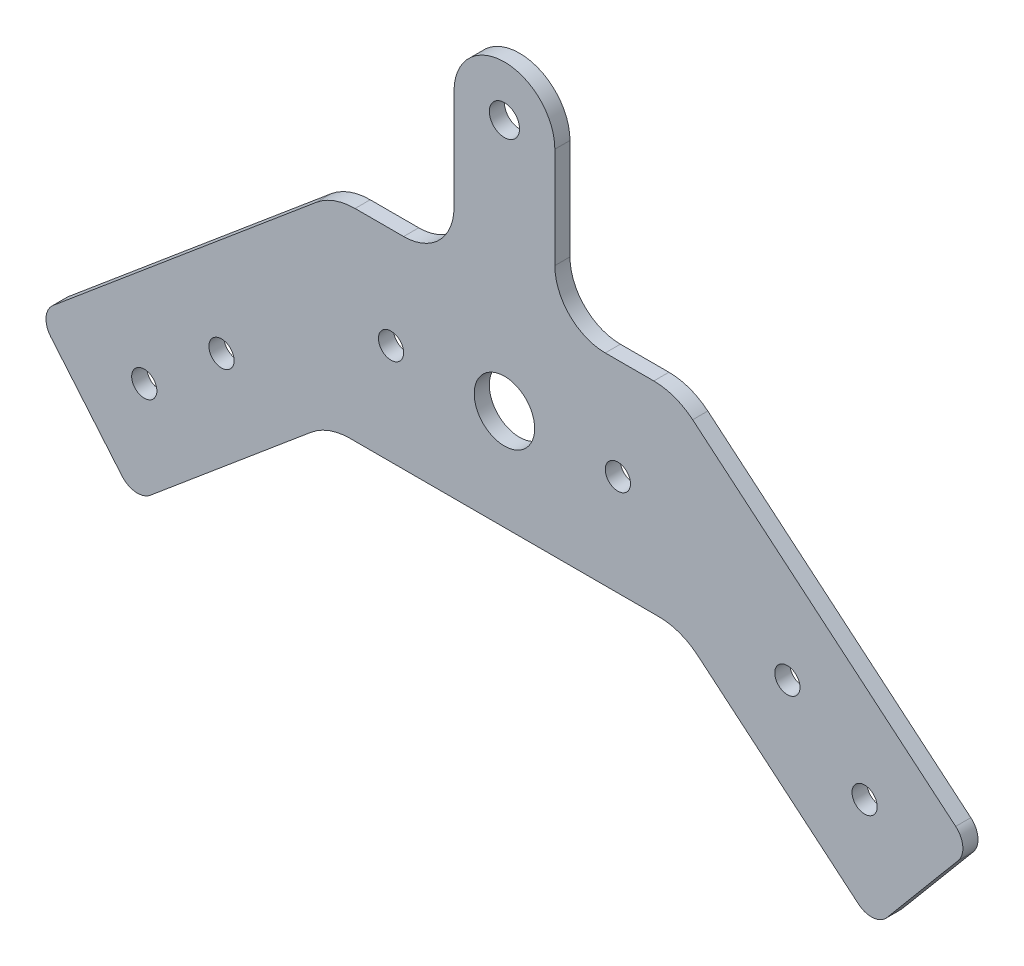
ISO-10303-21;
HEADER;
FILE_DESCRIPTION(('STEP AP214'),'2;1');
FILE_NAME('part.step','',(''),(''),'','','');
FILE_SCHEMA(('AUTOMOTIVE_DESIGN { 1 0 10303 214 1 1 1 1 }'));
ENDSEC;
DATA;
#1=APPLICATION_CONTEXT('core data for automotive mechanical design processes');
#2=APPLICATION_PROTOCOL_DEFINITION('international standard','automotive_design',2000,#1);
#3=PRODUCT_CONTEXT('',#1,'mechanical');
#4=PRODUCT('Part','Part','',(#3));
#5=PRODUCT_RELATED_PRODUCT_CATEGORY('part','',(#4));
#6=PRODUCT_DEFINITION_FORMATION('','',#4);
#7=PRODUCT_DEFINITION_CONTEXT('part definition',#1,'design');
#8=PRODUCT_DEFINITION('design','',#6,#7);
#9=PRODUCT_DEFINITION_SHAPE('','',#8);
#10=(LENGTH_UNIT() NAMED_UNIT(*) SI_UNIT(.MILLI.,.METRE.));
#11=(NAMED_UNIT(*) PLANE_ANGLE_UNIT() SI_UNIT($,.RADIAN.));
#12=(NAMED_UNIT(*) SI_UNIT($,.STERADIAN.) SOLID_ANGLE_UNIT());
#13=UNCERTAINTY_MEASURE_WITH_UNIT(LENGTH_MEASURE(1.E-05),#10,'distance_accuracy_value','');
#14=(GEOMETRIC_REPRESENTATION_CONTEXT(3) GLOBAL_UNCERTAINTY_ASSIGNED_CONTEXT((#13)) GLOBAL_UNIT_ASSIGNED_CONTEXT((#10,
#11,#12)) REPRESENTATION_CONTEXT('',''));
#15=CARTESIAN_POINT('',(0.,0.,0.));
#16=DIRECTION('',(0.,0.,1.));
#17=DIRECTION('',(1.,0.,0.));
#18=AXIS2_PLACEMENT_3D('',#15,#16,#17);
#19=CARTESIAN_POINT('',(-18.4144001216186,0.,-3.));
#20=DIRECTION('',(0.,-1.,0.));
#21=DIRECTION('',(1.,0.,0.));
#22=AXIS2_PLACEMENT_3D('',#19,#20,#21);
#23=PLANE('',#22);
#24=DIRECTION('',(1.,0.,0.));
#25=VECTOR('',#24,1.);
#26=CARTESIAN_POINT('',(-18.4144001216186,0.,0.));
#27=LINE('',#26,#25);
#28=CARTESIAN_POINT('',(-30.6323571888055,0.,0.));
#29=VERTEX_POINT('',#28);
#30=CARTESIAN_POINT('',(30.6323571888057,0.,0.));
#31=VERTEX_POINT('',#30);
#32=EDGE_CURVE('E278',#29,#31,#27,.T.);
#33=ORIENTED_EDGE('',*,*,#32,.F.);
#34=DIRECTION('',(0.,0.,1.));
#35=VECTOR('',#34,1.);
#36=CARTESIAN_POINT('',(-30.6323571888055,0.,-3.));
#37=LINE('',#36,#35);
#38=CARTESIAN_POINT('',(-30.6323571888055,0.,-3.));
#39=VERTEX_POINT('',#38);
#40=EDGE_CURVE('E11',#39,#29,#37,.T.);
#41=ORIENTED_EDGE('',*,*,#40,.F.);
#42=DIRECTION('',(1.,0.,0.));
#43=VECTOR('',#42,1.);
#44=CARTESIAN_POINT('',(-18.4144001216186,0.,-3.));
#45=LINE('',#44,#43);
#46=CARTESIAN_POINT('',(30.6323571888057,0.,-3.));
#47=VERTEX_POINT('',#46);
#48=EDGE_CURVE('E56',#39,#47,#45,.T.);
#49=ORIENTED_EDGE('',*,*,#48,.T.);
#50=DIRECTION('',(0.,0.,1.));
#51=VECTOR('',#50,1.);
#52=CARTESIAN_POINT('',(30.6323571888057,0.,-3.));
#53=LINE('',#52,#51);
#54=EDGE_CURVE('E41',#47,#31,#53,.T.);
#55=ORIENTED_EDGE('',*,*,#54,.T.);
#56=EDGE_LOOP('',(#33,#41,#49,#55));
#57=FACE_BOUND('',#56,.T.);
#58=ADVANCED_FACE('F37',(#57),#23,.T.);
#59=CARTESIAN_POINT('',(-30.6323571888055,-12.,-3.));
#60=DIRECTION('',(0.,0.,1.));
#61=DIRECTION('',(1.,0.,0.));
#62=AXIS2_PLACEMENT_3D('',#59,#60,#61);
#63=CYLINDRICAL_SURFACE('',#62,12.);
#64=CARTESIAN_POINT('',(-30.6323571888055,-12.,0.));
#65=DIRECTION('',(0.,0.,-1.));
#66=DIRECTION('',(1.,0.,0.));
#67=AXIS2_PLACEMENT_3D('',#64,#65,#66);
#68=CIRCLE('',#67,12.);
#69=CARTESIAN_POINT('',(-38.345808505044,-2.80746668257224,0.));
#70=VERTEX_POINT('',#69);
#71=EDGE_CURVE('E276',#70,#29,#68,.T.);
#72=ORIENTED_EDGE('',*,*,#71,.F.);
#73=DIRECTION('',(0.,0.,1.));
#74=VECTOR('',#73,1.);
#75=CARTESIAN_POINT('',(-38.345808505044,-2.80746668257224,-3.));
#76=LINE('',#75,#74);
#77=CARTESIAN_POINT('',(-38.345808505044,-2.80746668257224,-3.));
#78=VERTEX_POINT('',#77);
#79=EDGE_CURVE('E47',#78,#70,#76,.T.);
#80=ORIENTED_EDGE('',*,*,#79,.F.);
#81=CARTESIAN_POINT('',(-30.6323571888055,-12.,-3.));
#82=DIRECTION('',(0.,0.,-1.));
#83=DIRECTION('',(1.,0.,0.));
#84=AXIS2_PLACEMENT_3D('',#81,#82,#83);
#85=CIRCLE('',#84,12.);
#86=EDGE_CURVE('E208',#78,#39,#85,.T.);
#87=ORIENTED_EDGE('',*,*,#86,.T.);
#88=ORIENTED_EDGE('',*,*,#40,.T.);
#89=EDGE_LOOP('',(#72,#80,#87,#88));
#90=FACE_BOUND('',#89,.T.);
#91=ADVANCED_FACE('F321',(#90),#63,.F.);
#92=CARTESIAN_POINT('',(-38.345808505044,-2.80746668257224,-3.));
#93=DIRECTION('',(0.642787609686538,-0.766044443118979,0.));
#94=DIRECTION('',(0.766044443118979,0.642787609686538,0.));
#95=AXIS2_PLACEMENT_3D('',#92,#93,#94);
#96=PLANE('',#95);
#97=DIRECTION('',(0.766044443118979,0.642787609686538,0.));
#98=VECTOR('',#97,1.);
#99=CARTESIAN_POINT('',(-38.345808505044,-2.80746668257224,0.));
#100=LINE('',#99,#98);
#101=CARTESIAN_POINT('',(-70.238044383473,-29.5682300455807,0.));
#102=VERTEX_POINT('',#101);
#103=EDGE_CURVE('E196',#102,#70,#100,.T.);
#104=ORIENTED_EDGE('',*,*,#103,.F.);
#105=DIRECTION('',(0.,0.,1.));
#106=VECTOR('',#105,1.);
#107=CARTESIAN_POINT('',(-70.238044383473,-29.5682300455807,-3.));
#108=LINE('',#107,#106);
#109=CARTESIAN_POINT('',(-70.238044383473,-29.5682300455807,-3.));
#110=VERTEX_POINT('',#109);
#111=EDGE_CURVE('E191',#110,#102,#108,.T.);
#112=ORIENTED_EDGE('',*,*,#111,.F.);
#113=DIRECTION('',(0.766044443118979,0.642787609686538,0.));
#114=VECTOR('',#113,1.);
#115=CARTESIAN_POINT('',(-38.345808505044,-2.80746668257224,-3.));
#116=LINE('',#115,#114);
#117=EDGE_CURVE('E194',#110,#78,#116,.T.);
#118=ORIENTED_EDGE('',*,*,#117,.T.);
#119=ORIENTED_EDGE('',*,*,#79,.T.);
#120=EDGE_LOOP('',(#104,#112,#118,#119));
#121=FACE_BOUND('',#120,.T.);
#122=ADVANCED_FACE('F193',(#121),#96,.T.);
#123=CARTESIAN_POINT('',(-72.8091948222192,-26.5040522731048,-3.));
#124=DIRECTION('',(0.,0.,1.));
#125=DIRECTION('',(1.,0.,0.));
#126=AXIS2_PLACEMENT_3D('',#123,#124,#125);
#127=CYLINDRICAL_SURFACE('',#126,4.);
#128=CARTESIAN_POINT('',(-72.8091948222192,-26.5040522731048,0.));
#129=DIRECTION('',(0.,0.,1.));
#130=DIRECTION('',(-1.,0.,0.));
#131=AXIS2_PLACEMENT_3D('',#128,#129,#130);
#132=CIRCLE('',#131,4.);
#133=CARTESIAN_POINT('',(-75.8733725946951,-29.075202711851,0.));
#134=VERTEX_POINT('',#133);
#135=EDGE_CURVE('E273',#134,#102,#132,.T.);
#136=ORIENTED_EDGE('',*,*,#135,.F.);
#137=DIRECTION('',(0.,0.,1.));
#138=VECTOR('',#137,1.);
#139=CARTESIAN_POINT('',(-75.8733725946951,-29.075202711851,-3.));
#140=LINE('',#139,#138);
#141=CARTESIAN_POINT('',(-75.8733725946951,-29.075202711851,-3.));
#142=VERTEX_POINT('',#141);
#143=EDGE_CURVE('E201',#142,#134,#140,.T.);
#144=ORIENTED_EDGE('',*,*,#143,.F.);
#145=CARTESIAN_POINT('',(-72.8091948222192,-26.5040522731048,-3.));
#146=DIRECTION('',(0.,0.,1.));
#147=DIRECTION('',(-1.,0.,0.));
#148=AXIS2_PLACEMENT_3D('',#145,#146,#147);
#149=CIRCLE('',#148,4.);
#150=EDGE_CURVE('E206',#142,#110,#149,.T.);
#151=ORIENTED_EDGE('',*,*,#150,.T.);
#152=ORIENTED_EDGE('',*,*,#111,.T.);
#153=EDGE_LOOP('',(#136,#144,#151,#152));
#154=FACE_BOUND('',#153,.T.);
#155=ADVANCED_FACE('F210',(#154),#127,.T.);
#156=CARTESIAN_POINT('',(-75.8733725946951,-29.075202711851,-3.));
#157=DIRECTION('',(-0.766044443118979,-0.642787609686538,0.));
#158=DIRECTION('',(0.642787609686538,-0.766044443118979,0.));
#159=AXIS2_PLACEMENT_3D('',#156,#157,#158);
#160=PLANE('',#159);
#161=DIRECTION('',(0.642787609686538,-0.766044443118979,0.));
#162=VECTOR('',#161,1.);
#163=CARTESIAN_POINT('',(-75.8733725946951,-29.075202711851,0.));
#164=LINE('',#163,#162);
#165=CARTESIAN_POINT('',(-90.0147000077989,-12.2222249632334,0.));
#166=VERTEX_POINT('',#165);
#167=EDGE_CURVE('E270',#166,#134,#164,.T.);
#168=ORIENTED_EDGE('',*,*,#167,.F.);
#169=DIRECTION('',(0.,0.,1.));
#170=VECTOR('',#169,1.);
#171=CARTESIAN_POINT('',(-90.0147000077989,-12.2222249632334,-3.));
#172=LINE('',#171,#170);
#173=CARTESIAN_POINT('',(-90.0147000077989,-12.2222249632334,-3.));
#174=VERTEX_POINT('',#173);
#175=EDGE_CURVE('E282',#174,#166,#172,.T.);
#176=ORIENTED_EDGE('',*,*,#175,.F.);
#177=DIRECTION('',(0.642787609686538,-0.766044443118979,0.));
#178=VECTOR('',#177,1.);
#179=CARTESIAN_POINT('',(-75.8733725946951,-29.075202711851,-3.));
#180=LINE('',#179,#178);
#181=EDGE_CURVE('E211',#174,#142,#180,.T.);
#182=ORIENTED_EDGE('',*,*,#181,.T.);
#183=ORIENTED_EDGE('',*,*,#143,.T.);
#184=EDGE_LOOP('',(#168,#176,#182,#183));
#185=FACE_BOUND('',#184,.T.);
#186=ADVANCED_FACE('F334',(#185),#160,.T.);
#187=CARTESIAN_POINT('',(-86.950522235323,-9.65107452448727,-3.));
#188=DIRECTION('',(0.,0.,1.));
#189=DIRECTION('',(1.,0.,0.));
#190=AXIS2_PLACEMENT_3D('',#187,#188,#189);
#191=CYLINDRICAL_SURFACE('',#190,3.99999999999999);
#192=CARTESIAN_POINT('',(-86.950522235323,-9.65107452448727,0.));
#193=DIRECTION('',(0.,0.,1.));
#194=DIRECTION('',(1.,0.,0.));
#195=AXIS2_PLACEMENT_3D('',#192,#193,#194);
#196=CIRCLE('',#195,3.99999999999999);
#197=CARTESIAN_POINT('',(-89.5216726740692,-6.58689675201136,0.));
#198=VERTEX_POINT('',#197);
#199=EDGE_CURVE('E267',#198,#166,#196,.T.);
#200=ORIENTED_EDGE('',*,*,#199,.F.);
#201=DIRECTION('',(0.,0.,1.));
#202=VECTOR('',#201,1.);
#203=CARTESIAN_POINT('',(-89.5216726740692,-6.58689675201136,-3.));
#204=LINE('',#203,#202);
#205=CARTESIAN_POINT('',(-89.5216726740692,-6.58689675201136,-3.));
#206=VERTEX_POINT('',#205);
#207=EDGE_CURVE('E284',#206,#198,#204,.T.);
#208=ORIENTED_EDGE('',*,*,#207,.F.);
#209=CARTESIAN_POINT('',(-86.950522235323,-9.65107452448727,-3.));
#210=DIRECTION('',(0.,0.,1.));
#211=DIRECTION('',(1.,0.,0.));
#212=AXIS2_PLACEMENT_3D('',#209,#210,#211);
#213=CIRCLE('',#212,3.99999999999999);
#214=EDGE_CURVE('E213',#206,#174,#213,.T.);
#215=ORIENTED_EDGE('',*,*,#214,.T.);
#216=ORIENTED_EDGE('',*,*,#175,.T.);
#217=EDGE_LOOP('',(#200,#208,#215,#216));
#218=FACE_BOUND('',#217,.T.);
#219=ADVANCED_FACE('F337',(#218),#191,.T.);
#220=CARTESIAN_POINT('',(-89.5216726740692,-6.58689675201136,-3.));
#221=DIRECTION('',(-0.642787609686538,0.766044443118979,0.));
#222=DIRECTION('',(-0.766044443118979,-0.642787609686538,0.));
#223=AXIS2_PLACEMENT_3D('',#220,#221,#222);
#224=PLANE('',#223);
#225=DIRECTION('',(-0.766044443118979,-0.642787609686538,0.));
#226=VECTOR('',#225,1.);
#227=CARTESIAN_POINT('',(-89.5216726740692,-6.58689675201136,0.));
#228=LINE('',#227,#226);
#229=CARTESIAN_POINT('',(-37.3473796070879,37.1925333174278,0.));
#230=VERTEX_POINT('',#229);
#231=EDGE_CURVE('E264',#230,#198,#228,.T.);
#232=ORIENTED_EDGE('',*,*,#231,.F.);
#233=DIRECTION('',(0.,0.,1.));
#234=VECTOR('',#233,1.);
#235=CARTESIAN_POINT('',(-37.3473796070879,37.1925333174278,-3.));
#236=LINE('',#235,#234);
#237=CARTESIAN_POINT('',(-37.3473796070879,37.1925333174278,-3.));
#238=VERTEX_POINT('',#237);
#239=EDGE_CURVE('E286',#238,#230,#236,.T.);
#240=ORIENTED_EDGE('',*,*,#239,.F.);
#241=DIRECTION('',(-0.766044443118979,-0.642787609686538,0.));
#242=VECTOR('',#241,1.);
#243=CARTESIAN_POINT('',(-89.5216726740692,-6.58689675201136,-3.));
#244=LINE('',#243,#242);
#245=EDGE_CURVE('E457',#238,#206,#244,.T.);
#246=ORIENTED_EDGE('',*,*,#245,.T.);
#247=ORIENTED_EDGE('',*,*,#207,.T.);
#248=EDGE_LOOP('',(#232,#240,#246,#247));
#249=FACE_BOUND('',#248,.T.);
#250=ADVANCED_FACE('F341',(#249),#224,.T.);
#251=CARTESIAN_POINT('',(-29.6339282908495,28.,-3.));
#252=DIRECTION('',(0.,0.,1.));
#253=DIRECTION('',(1.,0.,0.));
#254=AXIS2_PLACEMENT_3D('',#251,#252,#253);
#255=CYLINDRICAL_SURFACE('',#254,12.);
#256=CARTESIAN_POINT('',(-29.6339282908495,28.,0.));
#257=DIRECTION('',(0.,0.,1.));
#258=DIRECTION('',(-1.,0.,0.));
#259=AXIS2_PLACEMENT_3D('',#256,#257,#258);
#260=CIRCLE('',#259,12.);
#261=CARTESIAN_POINT('',(-29.6339282908495,40.,0.));
#262=VERTEX_POINT('',#261);
#263=EDGE_CURVE('E261',#262,#230,#260,.T.);
#264=ORIENTED_EDGE('',*,*,#263,.F.);
#265=DIRECTION('',(0.,0.,1.));
#266=VECTOR('',#265,1.);
#267=CARTESIAN_POINT('',(-29.6339282908495,40.,-3.));
#268=LINE('',#267,#266);
#269=CARTESIAN_POINT('',(-29.6339282908495,40.,-3.));
#270=VERTEX_POINT('',#269);
#271=EDGE_CURVE('E288',#270,#262,#268,.T.);
#272=ORIENTED_EDGE('',*,*,#271,.F.);
#273=CARTESIAN_POINT('',(-29.6339282908495,28.,-3.));
#274=DIRECTION('',(0.,0.,1.));
#275=DIRECTION('',(-1.,0.,0.));
#276=AXIS2_PLACEMENT_3D('',#273,#274,#275);
#277=CIRCLE('',#276,12.);
#278=EDGE_CURVE('E461',#270,#238,#277,.T.);
#279=ORIENTED_EDGE('',*,*,#278,.T.);
#280=ORIENTED_EDGE('',*,*,#239,.T.);
#281=EDGE_LOOP('',(#264,#272,#279,#280));
#282=FACE_BOUND('',#281,.T.);
#283=ADVANCED_FACE('F345',(#282),#255,.T.);
#284=CARTESIAN_POINT('',(-29.6339282908495,40.,-3.));
#285=DIRECTION('',(0.,1.,0.));
#286=DIRECTION('',(-1.,0.,0.));
#287=AXIS2_PLACEMENT_3D('',#284,#285,#286);
#288=PLANE('',#287);
#289=DIRECTION('',(-1.,0.,0.));
#290=VECTOR('',#289,1.);
#291=CARTESIAN_POINT('',(-29.6339282908495,40.,0.));
#292=LINE('',#291,#290);
#293=CARTESIAN_POINT('',(-20.0000000000001,40.,0.));
#294=VERTEX_POINT('',#293);
#295=EDGE_CURVE('E258',#294,#262,#292,.T.);
#296=ORIENTED_EDGE('',*,*,#295,.F.);
#297=DIRECTION('',(0.,0.,1.));
#298=VECTOR('',#297,1.);
#299=CARTESIAN_POINT('',(-20.0000000000001,40.,-3.));
#300=LINE('',#299,#298);
#301=CARTESIAN_POINT('',(-20.0000000000001,40.,-3.));
#302=VERTEX_POINT('',#301);
#303=EDGE_CURVE('E290',#302,#294,#300,.T.);
#304=ORIENTED_EDGE('',*,*,#303,.F.);
#305=DIRECTION('',(-1.,0.,0.));
#306=VECTOR('',#305,1.);
#307=CARTESIAN_POINT('',(-29.6339282908495,40.,-3.));
#308=LINE('',#307,#306);
#309=EDGE_CURVE('E450',#302,#270,#308,.T.);
#310=ORIENTED_EDGE('',*,*,#309,.T.);
#311=ORIENTED_EDGE('',*,*,#271,.T.);
#312=EDGE_LOOP('',(#296,#304,#310,#311));
#313=FACE_BOUND('',#312,.T.);
#314=ADVANCED_FACE('F349',(#313),#288,.T.);
#315=CARTESIAN_POINT('',(-20.,50.,-3.));
#316=DIRECTION('',(0.,0.,1.));
#317=DIRECTION('',(1.,0.,0.));
#318=AXIS2_PLACEMENT_3D('',#315,#316,#317);
#319=CYLINDRICAL_SURFACE('',#318,10.);
#320=CARTESIAN_POINT('',(-20.,50.,0.));
#321=DIRECTION('',(0.,0.,-1.));
#322=DIRECTION('',(-1.,0.,0.));
#323=AXIS2_PLACEMENT_3D('',#320,#321,#322);
#324=CIRCLE('',#323,10.);
#325=CARTESIAN_POINT('',(-9.99999999999999,50.0000000000001,0.));
#326=VERTEX_POINT('',#325);
#327=EDGE_CURVE('E255',#326,#294,#324,.T.);
#328=ORIENTED_EDGE('',*,*,#327,.F.);
#329=DIRECTION('',(0.,0.,1.));
#330=VECTOR('',#329,1.);
#331=CARTESIAN_POINT('',(-9.99999999999999,50.0000000000001,-3.));
#332=LINE('',#331,#330);
#333=CARTESIAN_POINT('',(-9.99999999999999,50.0000000000001,-3.));
#334=VERTEX_POINT('',#333);
#335=EDGE_CURVE('E292',#334,#326,#332,.T.);
#336=ORIENTED_EDGE('',*,*,#335,.F.);
#337=CARTESIAN_POINT('',(-20.,50.,-3.));
#338=DIRECTION('',(0.,0.,-1.));
#339=DIRECTION('',(-1.,0.,0.));
#340=AXIS2_PLACEMENT_3D('',#337,#338,#339);
#341=CIRCLE('',#340,10.);
#342=EDGE_CURVE('E446',#334,#302,#341,.T.);
#343=ORIENTED_EDGE('',*,*,#342,.T.);
#344=ORIENTED_EDGE('',*,*,#303,.T.);
#345=EDGE_LOOP('',(#328,#336,#343,#344));
#346=FACE_BOUND('',#345,.T.);
#347=ADVANCED_FACE('F353',(#346),#319,.F.);
#348=CARTESIAN_POINT('',(-10.,70.,-3.));
#349=DIRECTION('',(-1.,0.,0.));
#350=DIRECTION('',(0.,-1.,0.));
#351=AXIS2_PLACEMENT_3D('',#348,#349,#350);
#352=PLANE('',#351);
#353=DIRECTION('',(0.,-1.,0.));
#354=VECTOR('',#353,1.);
#355=CARTESIAN_POINT('',(-10.,70.,0.));
#356=LINE('',#355,#354);
#357=CARTESIAN_POINT('',(-10.,70.,0.));
#358=VERTEX_POINT('',#357);
#359=EDGE_CURVE('E252',#358,#326,#356,.T.);
#360=ORIENTED_EDGE('',*,*,#359,.F.);
#361=DIRECTION('',(0.,0.,1.));
#362=VECTOR('',#361,1.);
#363=CARTESIAN_POINT('',(-10.,70.,-3.));
#364=LINE('',#363,#362);
#365=CARTESIAN_POINT('',(-10.,70.,-3.));
#366=VERTEX_POINT('',#365);
#367=EDGE_CURVE('E294',#366,#358,#364,.T.);
#368=ORIENTED_EDGE('',*,*,#367,.F.);
#369=DIRECTION('',(0.,-1.,0.));
#370=VECTOR('',#369,1.);
#371=CARTESIAN_POINT('',(-10.,70.,-3.));
#372=LINE('',#371,#370);
#373=EDGE_CURVE('E467',#366,#334,#372,.T.);
#374=ORIENTED_EDGE('',*,*,#373,.T.);
#375=ORIENTED_EDGE('',*,*,#335,.T.);
#376=EDGE_LOOP('',(#360,#368,#374,#375));
#377=FACE_BOUND('',#376,.T.);
#378=ADVANCED_FACE('F357',(#377),#352,.T.);
#379=CARTESIAN_POINT('',(0.,70.,-3.));
#380=DIRECTION('',(0.,0.,1.));
#381=DIRECTION('',(1.,0.,0.));
#382=AXIS2_PLACEMENT_3D('',#379,#380,#381);
#383=CYLINDRICAL_SURFACE('',#382,10.);
#384=CARTESIAN_POINT('',(0.,70.,0.));
#385=DIRECTION('',(0.,0.,1.));
#386=DIRECTION('',(1.,0.,0.));
#387=AXIS2_PLACEMENT_3D('',#384,#385,#386);
#388=CIRCLE('',#387,10.);
#389=CARTESIAN_POINT('',(10.,70.,0.));
#390=VERTEX_POINT('',#389);
#391=EDGE_CURVE('E249',#390,#358,#388,.T.);
#392=ORIENTED_EDGE('',*,*,#391,.F.);
#393=DIRECTION('',(0.,0.,1.));
#394=VECTOR('',#393,1.);
#395=CARTESIAN_POINT('',(10.,70.,-3.));
#396=LINE('',#395,#394);
#397=CARTESIAN_POINT('',(10.,70.,-3.));
#398=VERTEX_POINT('',#397);
#399=EDGE_CURVE('E296',#398,#390,#396,.T.);
#400=ORIENTED_EDGE('',*,*,#399,.F.);
#401=CARTESIAN_POINT('',(0.,70.,-3.));
#402=DIRECTION('',(0.,0.,1.));
#403=DIRECTION('',(1.,0.,0.));
#404=AXIS2_PLACEMENT_3D('',#401,#402,#403);
#405=CIRCLE('',#404,10.);
#406=EDGE_CURVE('E439',#398,#366,#405,.T.);
#407=ORIENTED_EDGE('',*,*,#406,.T.);
#408=ORIENTED_EDGE('',*,*,#367,.T.);
#409=EDGE_LOOP('',(#392,#400,#407,#408));
#410=FACE_BOUND('',#409,.T.);
#411=ADVANCED_FACE('F361',(#410),#383,.T.);
#412=CARTESIAN_POINT('',(10.,70.,-3.));
#413=DIRECTION('',(1.,0.,0.));
#414=DIRECTION('',(0.,0.,-1.));
#415=AXIS2_PLACEMENT_3D('',#412,#413,#414);
#416=PLANE('',#415);
#417=DIRECTION('',(0.,1.,0.));
#418=VECTOR('',#417,1.);
#419=CARTESIAN_POINT('',(10.,70.,0.));
#420=LINE('',#419,#418);
#421=CARTESIAN_POINT('',(10.,50.0000000000001,0.));
#422=VERTEX_POINT('',#421);
#423=EDGE_CURVE('E246',#422,#390,#420,.T.);
#424=ORIENTED_EDGE('',*,*,#423,.F.);
#425=DIRECTION('',(0.,0.,1.));
#426=VECTOR('',#425,1.);
#427=CARTESIAN_POINT('',(10.,50.0000000000001,-3.));
#428=LINE('',#427,#426);
#429=CARTESIAN_POINT('',(10.,50.0000000000001,-3.));
#430=VERTEX_POINT('',#429);
#431=EDGE_CURVE('E298',#430,#422,#428,.T.);
#432=ORIENTED_EDGE('',*,*,#431,.F.);
#433=DIRECTION('',(0.,1.,0.));
#434=VECTOR('',#433,1.);
#435=CARTESIAN_POINT('',(10.,70.,-3.));
#436=LINE('',#435,#434);
#437=EDGE_CURVE('E435',#430,#398,#436,.T.);
#438=ORIENTED_EDGE('',*,*,#437,.T.);
#439=ORIENTED_EDGE('',*,*,#399,.T.);
#440=EDGE_LOOP('',(#424,#432,#438,#439));
#441=FACE_BOUND('',#440,.T.);
#442=ADVANCED_FACE('F365',(#441),#416,.T.);
#443=CARTESIAN_POINT('',(20.,50.,-3.));
#444=DIRECTION('',(0.,0.,1.));
#445=DIRECTION('',(1.,0.,0.));
#446=AXIS2_PLACEMENT_3D('',#443,#444,#445);
#447=CYLINDRICAL_SURFACE('',#446,10.);
#448=CARTESIAN_POINT('',(20.,50.,0.));
#449=DIRECTION('',(0.,0.,-1.));
#450=DIRECTION('',(1.,0.,0.));
#451=AXIS2_PLACEMENT_3D('',#448,#449,#450);
#452=CIRCLE('',#451,10.);
#453=CARTESIAN_POINT('',(20.0000000000001,40.,0.));
#454=VERTEX_POINT('',#453);
#455=EDGE_CURVE('E243',#454,#422,#452,.T.);
#456=ORIENTED_EDGE('',*,*,#455,.F.);
#457=DIRECTION('',(0.,0.,1.));
#458=VECTOR('',#457,1.);
#459=CARTESIAN_POINT('',(20.0000000000001,40.,-3.));
#460=LINE('',#459,#458);
#461=CARTESIAN_POINT('',(20.0000000000001,40.,-3.));
#462=VERTEX_POINT('',#461);
#463=EDGE_CURVE('E300',#462,#454,#460,.T.);
#464=ORIENTED_EDGE('',*,*,#463,.F.);
#465=CARTESIAN_POINT('',(20.,50.,-3.));
#466=DIRECTION('',(0.,0.,-1.));
#467=DIRECTION('',(1.,0.,0.));
#468=AXIS2_PLACEMENT_3D('',#465,#466,#467);
#469=CIRCLE('',#468,10.);
#470=EDGE_CURVE('E471',#462,#430,#469,.T.);
#471=ORIENTED_EDGE('',*,*,#470,.T.);
#472=ORIENTED_EDGE('',*,*,#431,.T.);
#473=EDGE_LOOP('',(#456,#464,#471,#472));
#474=FACE_BOUND('',#473,.T.);
#475=ADVANCED_FACE('F369',(#474),#447,.F.);
#476=CARTESIAN_POINT('',(29.6339282908495,40.,-3.));
#477=DIRECTION('',(0.,1.,0.));
#478=DIRECTION('',(-1.,0.,0.));
#479=AXIS2_PLACEMENT_3D('',#476,#477,#478);
#480=PLANE('',#479);
#481=DIRECTION('',(-1.,0.,0.));
#482=VECTOR('',#481,1.);
#483=CARTESIAN_POINT('',(29.6339282908495,40.,0.));
#484=LINE('',#483,#482);
#485=CARTESIAN_POINT('',(29.6339282908495,40.,0.));
#486=VERTEX_POINT('',#485);
#487=EDGE_CURVE('E240',#486,#454,#484,.T.);
#488=ORIENTED_EDGE('',*,*,#487,.F.);
#489=DIRECTION('',(0.,0.,1.));
#490=VECTOR('',#489,1.);
#491=CARTESIAN_POINT('',(29.6339282908495,40.,-3.));
#492=LINE('',#491,#490);
#493=CARTESIAN_POINT('',(29.6339282908495,40.,-3.));
#494=VERTEX_POINT('',#493);
#495=EDGE_CURVE('E302',#494,#486,#492,.T.);
#496=ORIENTED_EDGE('',*,*,#495,.F.);
#497=DIRECTION('',(-1.,0.,0.));
#498=VECTOR('',#497,1.);
#499=CARTESIAN_POINT('',(29.6339282908495,40.,-3.));
#500=LINE('',#499,#498);
#501=EDGE_CURVE('E428',#494,#462,#500,.T.);
#502=ORIENTED_EDGE('',*,*,#501,.T.);
#503=ORIENTED_EDGE('',*,*,#463,.T.);
#504=EDGE_LOOP('',(#488,#496,#502,#503));
#505=FACE_BOUND('',#504,.T.);
#506=ADVANCED_FACE('F373',(#505),#480,.T.);
#507=CARTESIAN_POINT('',(29.6339282908495,28.,-3.));
#508=DIRECTION('',(0.,0.,1.));
#509=DIRECTION('',(1.,0.,0.));
#510=AXIS2_PLACEMENT_3D('',#507,#508,#509);
#511=CYLINDRICAL_SURFACE('',#510,12.);
#512=CARTESIAN_POINT('',(29.6339282908495,28.,0.));
#513=DIRECTION('',(0.,0.,1.));
#514=DIRECTION('',(1.,0.,0.));
#515=AXIS2_PLACEMENT_3D('',#512,#513,#514);
#516=CIRCLE('',#515,12.);
#517=CARTESIAN_POINT('',(37.3473796070879,37.1925333174278,0.));
#518=VERTEX_POINT('',#517);
#519=EDGE_CURVE('E237',#518,#486,#516,.T.);
#520=ORIENTED_EDGE('',*,*,#519,.F.);
#521=DIRECTION('',(0.,0.,1.));
#522=VECTOR('',#521,1.);
#523=CARTESIAN_POINT('',(37.3473796070879,37.1925333174278,-3.));
#524=LINE('',#523,#522);
#525=CARTESIAN_POINT('',(37.3473796070879,37.1925333174278,-3.));
#526=VERTEX_POINT('',#525);
#527=EDGE_CURVE('E304',#526,#518,#524,.T.);
#528=ORIENTED_EDGE('',*,*,#527,.F.);
#529=CARTESIAN_POINT('',(29.6339282908495,28.,-3.));
#530=DIRECTION('',(0.,0.,1.));
#531=DIRECTION('',(1.,0.,0.));
#532=AXIS2_PLACEMENT_3D('',#529,#530,#531);
#533=CIRCLE('',#532,12.);
#534=EDGE_CURVE('E424',#526,#494,#533,.T.);
#535=ORIENTED_EDGE('',*,*,#534,.T.);
#536=ORIENTED_EDGE('',*,*,#495,.T.);
#537=EDGE_LOOP('',(#520,#528,#535,#536));
#538=FACE_BOUND('',#537,.T.);
#539=ADVANCED_FACE('F377',(#538),#511,.T.);
#540=CARTESIAN_POINT('',(89.5216726740692,-6.58689675201139,-3.));
#541=DIRECTION('',(0.642787609686538,0.766044443118979,0.));
#542=DIRECTION('',(-0.766044443118979,0.642787609686538,0.));
#543=AXIS2_PLACEMENT_3D('',#540,#541,#542);
#544=PLANE('',#543);
#545=DIRECTION('',(-0.766044443118979,0.642787609686538,0.));
#546=VECTOR('',#545,1.);
#547=CARTESIAN_POINT('',(89.5216726740692,-6.58689675201139,0.));
#548=LINE('',#547,#546);
#549=CARTESIAN_POINT('',(89.5216726740692,-6.58689675201138,0.));
#550=VERTEX_POINT('',#549);
#551=EDGE_CURVE('E234',#550,#518,#548,.T.);
#552=ORIENTED_EDGE('',*,*,#551,.F.);
#553=DIRECTION('',(0.,0.,1.));
#554=VECTOR('',#553,1.);
#555=CARTESIAN_POINT('',(89.5216726740692,-6.58689675201138,-3.));
#556=LINE('',#555,#554);
#557=CARTESIAN_POINT('',(89.5216726740692,-6.58689675201138,-3.));
#558=VERTEX_POINT('',#557);
#559=EDGE_CURVE('E306',#558,#550,#556,.T.);
#560=ORIENTED_EDGE('',*,*,#559,.F.);
#561=DIRECTION('',(-0.766044443118979,0.642787609686538,0.));
#562=VECTOR('',#561,1.);
#563=CARTESIAN_POINT('',(89.5216726740692,-6.58689675201139,-3.));
#564=LINE('',#563,#562);
#565=EDGE_CURVE('E475',#558,#526,#564,.T.);
#566=ORIENTED_EDGE('',*,*,#565,.T.);
#567=ORIENTED_EDGE('',*,*,#527,.T.);
#568=EDGE_LOOP('',(#552,#560,#566,#567));
#569=FACE_BOUND('',#568,.T.);
#570=ADVANCED_FACE('F381',(#569),#544,.T.);
#571=CARTESIAN_POINT('',(86.950522235323,-9.65107452448731,-3.));
#572=DIRECTION('',(0.,0.,1.));
#573=DIRECTION('',(1.,0.,0.));
#574=AXIS2_PLACEMENT_3D('',#571,#572,#573);
#575=CYLINDRICAL_SURFACE('',#574,4.00000000000001);
#576=CARTESIAN_POINT('',(86.950522235323,-9.65107452448731,0.));
#577=DIRECTION('',(0.,0.,1.));
#578=DIRECTION('',(-1.,0.,0.));
#579=AXIS2_PLACEMENT_3D('',#576,#577,#578);
#580=CIRCLE('',#579,4.00000000000001);
#581=CARTESIAN_POINT('',(90.014700007799,-12.2222249632335,0.));
#582=VERTEX_POINT('',#581);
#583=EDGE_CURVE('E231',#582,#550,#580,.T.);
#584=ORIENTED_EDGE('',*,*,#583,.F.);
#585=DIRECTION('',(0.,0.,1.));
#586=VECTOR('',#585,1.);
#587=CARTESIAN_POINT('',(90.014700007799,-12.2222249632335,-3.));
#588=LINE('',#587,#586);
#589=CARTESIAN_POINT('',(90.014700007799,-12.2222249632335,-3.));
#590=VERTEX_POINT('',#589);
#591=EDGE_CURVE('E308',#590,#582,#588,.T.);
#592=ORIENTED_EDGE('',*,*,#591,.F.);
#593=CARTESIAN_POINT('',(86.950522235323,-9.65107452448731,-3.));
#594=DIRECTION('',(0.,0.,1.));
#595=DIRECTION('',(-1.,0.,0.));
#596=AXIS2_PLACEMENT_3D('',#593,#594,#595);
#597=CIRCLE('',#596,4.00000000000001);
#598=EDGE_CURVE('E417',#590,#558,#597,.T.);
#599=ORIENTED_EDGE('',*,*,#598,.T.);
#600=ORIENTED_EDGE('',*,*,#559,.T.);
#601=EDGE_LOOP('',(#584,#592,#599,#600));
#602=FACE_BOUND('',#601,.T.);
#603=ADVANCED_FACE('F385',(#602),#575,.T.);
#604=CARTESIAN_POINT('',(90.014700007799,-12.2222249632335,-3.));
#605=DIRECTION('',(0.766044443118979,-0.642787609686538,0.));
#606=DIRECTION('',(0.642787609686538,0.766044443118979,0.));
#607=AXIS2_PLACEMENT_3D('',#604,#605,#606);
#608=PLANE('',#607);
#609=DIRECTION('',(0.642787609686538,0.766044443118979,0.));
#610=VECTOR('',#609,1.);
#611=CARTESIAN_POINT('',(90.014700007799,-12.2222249632335,0.));
#612=LINE('',#611,#610);
#613=CARTESIAN_POINT('',(75.8733725946952,-29.0752027118509,0.));
#614=VERTEX_POINT('',#613);
#615=EDGE_CURVE('E228',#614,#582,#612,.T.);
#616=ORIENTED_EDGE('',*,*,#615,.F.);
#617=DIRECTION('',(0.,0.,1.));
#618=VECTOR('',#617,1.);
#619=CARTESIAN_POINT('',(75.8733725946952,-29.0752027118509,-3.));
#620=LINE('',#619,#618);
#621=CARTESIAN_POINT('',(75.8733725946952,-29.0752027118509,-3.));
#622=VERTEX_POINT('',#621);
#623=EDGE_CURVE('E310',#622,#614,#620,.T.);
#624=ORIENTED_EDGE('',*,*,#623,.F.);
#625=DIRECTION('',(0.642787609686538,0.766044443118979,0.));
#626=VECTOR('',#625,1.);
#627=CARTESIAN_POINT('',(90.014700007799,-12.2222249632335,-3.));
#628=LINE('',#627,#626);
#629=EDGE_CURVE('E413',#622,#590,#628,.T.);
#630=ORIENTED_EDGE('',*,*,#629,.T.);
#631=ORIENTED_EDGE('',*,*,#591,.T.);
#632=EDGE_LOOP('',(#616,#624,#630,#631));
#633=FACE_BOUND('',#632,.T.);
#634=ADVANCED_FACE('F389',(#633),#608,.T.);
#635=CARTESIAN_POINT('',(72.8091948222193,-26.5040522731048,-3.));
#636=DIRECTION('',(0.,0.,1.));
#637=DIRECTION('',(1.,0.,0.));
#638=AXIS2_PLACEMENT_3D('',#635,#636,#637);
#639=CYLINDRICAL_SURFACE('',#638,4.);
#640=CARTESIAN_POINT('',(72.8091948222193,-26.5040522731048,0.));
#641=DIRECTION('',(0.,0.,1.));
#642=DIRECTION('',(-1.,0.,0.));
#643=AXIS2_PLACEMENT_3D('',#640,#641,#642);
#644=CIRCLE('',#643,4.);
#645=CARTESIAN_POINT('',(70.2380443834731,-29.5682300455807,0.));
#646=VERTEX_POINT('',#645);
#647=EDGE_CURVE('E225',#646,#614,#644,.T.);
#648=ORIENTED_EDGE('',*,*,#647,.F.);
#649=DIRECTION('',(0.,0.,1.));
#650=VECTOR('',#649,1.);
#651=CARTESIAN_POINT('',(70.2380443834731,-29.5682300455807,-3.));
#652=LINE('',#651,#650);
#653=CARTESIAN_POINT('',(70.2380443834731,-29.5682300455807,-3.));
#654=VERTEX_POINT('',#653);
#655=EDGE_CURVE('E312',#654,#646,#652,.T.);
#656=ORIENTED_EDGE('',*,*,#655,.F.);
#657=CARTESIAN_POINT('',(72.8091948222193,-26.5040522731048,-3.));
#658=DIRECTION('',(0.,0.,1.));
#659=DIRECTION('',(-1.,0.,0.));
#660=AXIS2_PLACEMENT_3D('',#657,#658,#659);
#661=CIRCLE('',#660,4.);
#662=EDGE_CURVE('E479',#654,#622,#661,.T.);
#663=ORIENTED_EDGE('',*,*,#662,.T.);
#664=ORIENTED_EDGE('',*,*,#623,.T.);
#665=EDGE_LOOP('',(#648,#656,#663,#664));
#666=FACE_BOUND('',#665,.T.);
#667=ADVANCED_FACE('F393',(#666),#639,.T.);
#668=CARTESIAN_POINT('',(70.2380443834731,-29.5682300455807,-3.));
#669=DIRECTION('',(-0.642787609686537,-0.76604444311898,0.));
#670=DIRECTION('',(0.76604444311898,-0.642787609686537,0.));
#671=AXIS2_PLACEMENT_3D('',#668,#669,#670);
#672=PLANE('',#671);
#673=DIRECTION('',(0.76604444311898,-0.642787609686537,0.));
#674=VECTOR('',#673,1.);
#675=CARTESIAN_POINT('',(70.2380443834731,-29.5682300455807,0.));
#676=LINE('',#675,#674);
#677=CARTESIAN_POINT('',(38.3458085050441,-2.80746668257222,0.));
#678=VERTEX_POINT('',#677);
#679=EDGE_CURVE('E221',#678,#646,#676,.T.);
#680=ORIENTED_EDGE('',*,*,#679,.F.);
#681=DIRECTION('',(0.,0.,1.));
#682=VECTOR('',#681,1.);
#683=CARTESIAN_POINT('',(38.3458085050441,-2.80746668257222,-3.));
#684=LINE('',#683,#682);
#685=CARTESIAN_POINT('',(38.3458085050441,-2.80746668257222,-3.));
#686=VERTEX_POINT('',#685);
#687=EDGE_CURVE('E313',#686,#678,#684,.T.);
#688=ORIENTED_EDGE('',*,*,#687,.F.);
#689=DIRECTION('',(0.76604444311898,-0.642787609686537,0.));
#690=VECTOR('',#689,1.);
#691=CARTESIAN_POINT('',(70.2380443834731,-29.5682300455807,-3.));
#692=LINE('',#691,#690);
#693=EDGE_CURVE('E406',#686,#654,#692,.T.);
#694=ORIENTED_EDGE('',*,*,#693,.T.);
#695=ORIENTED_EDGE('',*,*,#655,.T.);
#696=EDGE_LOOP('',(#680,#688,#694,#695));
#697=FACE_BOUND('',#696,.T.);
#698=ADVANCED_FACE('F396',(#697),#672,.T.);
#699=CARTESIAN_POINT('',(30.6323571888057,-12.,-3.));
#700=DIRECTION('',(0.,0.,1.));
#701=DIRECTION('',(1.,0.,0.));
#702=AXIS2_PLACEMENT_3D('',#699,#700,#701);
#703=CYLINDRICAL_SURFACE('',#702,12.);
#704=CARTESIAN_POINT('',(30.6323571888057,-12.,0.));
#705=DIRECTION('',(0.,0.,-1.));
#706=DIRECTION('',(1.,0.,0.));
#707=AXIS2_PLACEMENT_3D('',#704,#705,#706);
#708=CIRCLE('',#707,12.);
#709=EDGE_CURVE('E218',#31,#678,#708,.T.);
#710=ORIENTED_EDGE('',*,*,#709,.F.);
#711=ORIENTED_EDGE('',*,*,#54,.F.);
#712=CARTESIAN_POINT('',(30.6323571888057,-12.,-3.));
#713=DIRECTION('',(0.,0.,-1.));
#714=DIRECTION('',(1.,0.,0.));
#715=AXIS2_PLACEMENT_3D('',#712,#713,#714);
#716=CIRCLE('',#715,12.);
#717=EDGE_CURVE('E482',#47,#686,#716,.T.);
#718=ORIENTED_EDGE('',*,*,#717,.T.);
#719=ORIENTED_EDGE('',*,*,#687,.T.);
#720=EDGE_LOOP('',(#710,#711,#718,#719));
#721=FACE_BOUND('',#720,.T.);
#722=ADVANCED_FACE('F39',(#721),#703,.F.);
#723=CARTESIAN_POINT('',(30.6323571888057,-12.,-3.));
#724=DIRECTION('',(0.,0.,1.));
#725=DIRECTION('',(1.,0.,0.));
#726=AXIS2_PLACEMENT_3D('',#723,#724,#725);
#727=PLANE('',#726);
#728=CARTESIAN_POINT('',(22.5,20.,-3.));
#729=DIRECTION('',(0.,0.,1.));
#730=DIRECTION('',(-1.,0.,0.));
#731=AXIS2_PLACEMENT_3D('',#728,#729,#730);
#732=CIRCLE('',#731,2.5);
#733=CARTESIAN_POINT('',(20.,20.,-3.));
#734=VERTEX_POINT('',#733);
#735=EDGE_CURVE('E524',#734,#734,#732,.T.);
#736=ORIENTED_EDGE('',*,*,#735,.T.);
#737=EDGE_LOOP('',(#736));
#738=FACE_BOUND('',#737,.T.);
#739=CARTESIAN_POINT('',(-22.5,20.,-3.));
#740=DIRECTION('',(0.,0.,1.));
#741=DIRECTION('',(1.,0.,0.));
#742=AXIS2_PLACEMENT_3D('',#739,#740,#741);
#743=CIRCLE('',#742,2.5);
#744=CARTESIAN_POINT('',(-20.,20.,-3.));
#745=VERTEX_POINT('',#744);
#746=EDGE_CURVE('E518',#745,#745,#743,.T.);
#747=ORIENTED_EDGE('',*,*,#746,.T.);
#748=EDGE_LOOP('',(#747));
#749=FACE_BOUND('',#748,.T.);
#750=CARTESIAN_POINT('',(0.,20.,-3.));
#751=DIRECTION('',(0.,0.,1.));
#752=DIRECTION('',(1.,0.,0.));
#753=AXIS2_PLACEMENT_3D('',#750,#751,#752);
#754=CIRCLE('',#753,6.);
#755=CARTESIAN_POINT('',(6.,20.,-3.));
#756=VERTEX_POINT('',#755);
#757=EDGE_CURVE('E512',#756,#756,#754,.T.);
#758=ORIENTED_EDGE('',*,*,#757,.T.);
#759=EDGE_LOOP('',(#758));
#760=FACE_BOUND('',#759,.T.);
#761=CARTESIAN_POINT('',(71.4533696544623,-11.0068996922441,-3.));
#762=DIRECTION('',(0.,0.,1.));
#763=DIRECTION('',(-1.,0.,0.));
#764=AXIS2_PLACEMENT_3D('',#761,#762,#763);
#765=CIRCLE('',#764,2.49999999999999);
#766=CARTESIAN_POINT('',(68.9533696544623,-11.0068996922441,-3.));
#767=VERTEX_POINT('',#766);
#768=EDGE_CURVE('E506',#767,#767,#765,.T.);
#769=ORIENTED_EDGE('',*,*,#768,.T.);
#770=EDGE_LOOP('',(#769));
#771=FACE_BOUND('',#770,.T.);
#772=CARTESIAN_POINT('',(56.1324807920827,1.84885250148663,-3.));
#773=DIRECTION('',(0.,0.,1.));
#774=DIRECTION('',(-1.,0.,0.));
#775=AXIS2_PLACEMENT_3D('',#772,#773,#774);
#776=CIRCLE('',#775,2.49999999999999);
#777=CARTESIAN_POINT('',(53.6324807920828,1.84885250148663,-3.));
#778=VERTEX_POINT('',#777);
#779=EDGE_CURVE('E500',#778,#778,#776,.T.);
#780=ORIENTED_EDGE('',*,*,#779,.T.);
#781=EDGE_LOOP('',(#780));
#782=FACE_BOUND('',#781,.T.);
#783=CARTESIAN_POINT('',(-56.1324807920827,1.84885250148663,-3.));
#784=DIRECTION('',(0.,0.,1.));
#785=DIRECTION('',(1.,0.,0.));
#786=AXIS2_PLACEMENT_3D('',#783,#784,#785);
#787=CIRCLE('',#786,2.49999999999999);
#788=CARTESIAN_POINT('',(-53.6324807920828,1.84885250148663,-3.));
#789=VERTEX_POINT('',#788);
#790=EDGE_CURVE('E494',#789,#789,#787,.T.);
#791=ORIENTED_EDGE('',*,*,#790,.T.);
#792=EDGE_LOOP('',(#791));
#793=FACE_BOUND('',#792,.T.);
#794=CARTESIAN_POINT('',(-71.4533696544623,-11.0068996922441,-3.));
#795=DIRECTION('',(0.,0.,1.));
#796=DIRECTION('',(1.,0.,0.));
#797=AXIS2_PLACEMENT_3D('',#794,#795,#796);
#798=CIRCLE('',#797,2.49999999999999);
#799=CARTESIAN_POINT('',(-68.9533696544623,-11.0068996922441,-3.));
#800=VERTEX_POINT('',#799);
#801=EDGE_CURVE('E488',#800,#800,#798,.T.);
#802=ORIENTED_EDGE('',*,*,#801,.T.);
#803=EDGE_LOOP('',(#802));
#804=FACE_BOUND('',#803,.T.);
#805=CARTESIAN_POINT('',(0.,70.,-3.));
#806=DIRECTION('',(0.,0.,1.));
#807=DIRECTION('',(1.,0.,0.));
#808=AXIS2_PLACEMENT_3D('',#805,#806,#807);
#809=CIRCLE('',#808,3.);
#810=CARTESIAN_POINT('',(3.,70.,-3.));
#811=VERTEX_POINT('',#810);
#812=EDGE_CURVE('E222',#811,#811,#809,.T.);
#813=ORIENTED_EDGE('',*,*,#812,.T.);
#814=EDGE_LOOP('',(#813));
#815=FACE_BOUND('',#814,.T.);
#816=ORIENTED_EDGE('',*,*,#48,.F.);
#817=ORIENTED_EDGE('',*,*,#86,.F.);
#818=ORIENTED_EDGE('',*,*,#117,.F.);
#819=ORIENTED_EDGE('',*,*,#150,.F.);
#820=ORIENTED_EDGE('',*,*,#181,.F.);
#821=ORIENTED_EDGE('',*,*,#214,.F.);
#822=ORIENTED_EDGE('',*,*,#245,.F.);
#823=ORIENTED_EDGE('',*,*,#278,.F.);
#824=ORIENTED_EDGE('',*,*,#309,.F.);
#825=ORIENTED_EDGE('',*,*,#342,.F.);
#826=ORIENTED_EDGE('',*,*,#373,.F.);
#827=ORIENTED_EDGE('',*,*,#406,.F.);
#828=ORIENTED_EDGE('',*,*,#437,.F.);
#829=ORIENTED_EDGE('',*,*,#470,.F.);
#830=ORIENTED_EDGE('',*,*,#501,.F.);
#831=ORIENTED_EDGE('',*,*,#534,.F.);
#832=ORIENTED_EDGE('',*,*,#565,.F.);
#833=ORIENTED_EDGE('',*,*,#598,.F.);
#834=ORIENTED_EDGE('',*,*,#629,.F.);
#835=ORIENTED_EDGE('',*,*,#662,.F.);
#836=ORIENTED_EDGE('',*,*,#693,.F.);
#837=ORIENTED_EDGE('',*,*,#717,.F.);
#838=EDGE_LOOP('',(#816,#817,#818,#819,#820,#821,#822,#823,#824,#825,#826,#827,#828,#829,#830,
#831,#832,#833,#834,#835,#836,#837));
#839=FACE_BOUND('',#838,.T.);
#840=ADVANCED_FACE('F204',(#738,#749,#760,#771,#782,#793,#804,#815,#839),#727,.F.);
#841=CARTESIAN_POINT('',(30.6323571888057,-12.,0.));
#842=DIRECTION('',(0.,0.,1.));
#843=DIRECTION('',(1.,0.,0.));
#844=AXIS2_PLACEMENT_3D('',#841,#842,#843);
#845=PLANE('',#844);
#846=CARTESIAN_POINT('',(22.5,20.,0.));
#847=DIRECTION('',(0.,0.,1.));
#848=DIRECTION('',(-1.,0.,0.));
#849=AXIS2_PLACEMENT_3D('',#846,#847,#848);
#850=CIRCLE('',#849,2.5);
#851=CARTESIAN_POINT('',(20.,20.,0.));
#852=VERTEX_POINT('',#851);
#853=EDGE_CURVE('E527',#852,#852,#850,.T.);
#854=ORIENTED_EDGE('',*,*,#853,.F.);
#855=EDGE_LOOP('',(#854));
#856=FACE_BOUND('',#855,.T.);
#857=CARTESIAN_POINT('',(-22.5,20.,0.));
#858=DIRECTION('',(0.,0.,1.));
#859=DIRECTION('',(1.,0.,0.));
#860=AXIS2_PLACEMENT_3D('',#857,#858,#859);
#861=CIRCLE('',#860,2.5);
#862=CARTESIAN_POINT('',(-20.,20.,0.));
#863=VERTEX_POINT('',#862);
#864=EDGE_CURVE('E521',#863,#863,#861,.T.);
#865=ORIENTED_EDGE('',*,*,#864,.F.);
#866=EDGE_LOOP('',(#865));
#867=FACE_BOUND('',#866,.T.);
#868=CARTESIAN_POINT('',(0.,20.,0.));
#869=DIRECTION('',(0.,0.,1.));
#870=DIRECTION('',(1.,0.,0.));
#871=AXIS2_PLACEMENT_3D('',#868,#869,#870);
#872=CIRCLE('',#871,6.);
#873=CARTESIAN_POINT('',(6.,20.,0.));
#874=VERTEX_POINT('',#873);
#875=EDGE_CURVE('E515',#874,#874,#872,.T.);
#876=ORIENTED_EDGE('',*,*,#875,.F.);
#877=EDGE_LOOP('',(#876));
#878=FACE_BOUND('',#877,.T.);
#879=CARTESIAN_POINT('',(71.4533696544623,-11.0068996922441,0.));
#880=DIRECTION('',(0.,0.,1.));
#881=DIRECTION('',(-1.,0.,0.));
#882=AXIS2_PLACEMENT_3D('',#879,#880,#881);
#883=CIRCLE('',#882,2.49999999999999);
#884=CARTESIAN_POINT('',(68.9533696544623,-11.0068996922441,0.));
#885=VERTEX_POINT('',#884);
#886=EDGE_CURVE('E509',#885,#885,#883,.T.);
#887=ORIENTED_EDGE('',*,*,#886,.F.);
#888=EDGE_LOOP('',(#887));
#889=FACE_BOUND('',#888,.T.);
#890=CARTESIAN_POINT('',(56.1324807920827,1.84885250148663,0.));
#891=DIRECTION('',(0.,0.,1.));
#892=DIRECTION('',(-1.,0.,0.));
#893=AXIS2_PLACEMENT_3D('',#890,#891,#892);
#894=CIRCLE('',#893,2.49999999999999);
#895=CARTESIAN_POINT('',(53.6324807920828,1.84885250148663,0.));
#896=VERTEX_POINT('',#895);
#897=EDGE_CURVE('E503',#896,#896,#894,.T.);
#898=ORIENTED_EDGE('',*,*,#897,.F.);
#899=EDGE_LOOP('',(#898));
#900=FACE_BOUND('',#899,.T.);
#901=CARTESIAN_POINT('',(-56.1324807920827,1.84885250148663,0.));
#902=DIRECTION('',(0.,0.,1.));
#903=DIRECTION('',(1.,0.,0.));
#904=AXIS2_PLACEMENT_3D('',#901,#902,#903);
#905=CIRCLE('',#904,2.49999999999999);
#906=CARTESIAN_POINT('',(-53.6324807920828,1.84885250148663,0.));
#907=VERTEX_POINT('',#906);
#908=EDGE_CURVE('E497',#907,#907,#905,.T.);
#909=ORIENTED_EDGE('',*,*,#908,.F.);
#910=EDGE_LOOP('',(#909));
#911=FACE_BOUND('',#910,.T.);
#912=CARTESIAN_POINT('',(-71.4533696544623,-11.0068996922441,0.));
#913=DIRECTION('',(0.,0.,1.));
#914=DIRECTION('',(1.,0.,0.));
#915=AXIS2_PLACEMENT_3D('',#912,#913,#914);
#916=CIRCLE('',#915,2.49999999999999);
#917=CARTESIAN_POINT('',(-68.9533696544623,-11.0068996922441,0.));
#918=VERTEX_POINT('',#917);
#919=EDGE_CURVE('E491',#918,#918,#916,.T.);
#920=ORIENTED_EDGE('',*,*,#919,.F.);
#921=EDGE_LOOP('',(#920));
#922=FACE_BOUND('',#921,.T.);
#923=CARTESIAN_POINT('',(0.,70.,0.));
#924=DIRECTION('',(0.,0.,1.));
#925=DIRECTION('',(1.,0.,0.));
#926=AXIS2_PLACEMENT_3D('',#923,#924,#925);
#927=CIRCLE('',#926,3.);
#928=CARTESIAN_POINT('',(3.,70.,0.));
#929=VERTEX_POINT('',#928);
#930=EDGE_CURVE('E485',#929,#929,#927,.T.);
#931=ORIENTED_EDGE('',*,*,#930,.F.);
#932=EDGE_LOOP('',(#931));
#933=FACE_BOUND('',#932,.T.);
#934=ORIENTED_EDGE('',*,*,#32,.T.);
#935=ORIENTED_EDGE('',*,*,#709,.T.);
#936=ORIENTED_EDGE('',*,*,#679,.T.);
#937=ORIENTED_EDGE('',*,*,#647,.T.);
#938=ORIENTED_EDGE('',*,*,#615,.T.);
#939=ORIENTED_EDGE('',*,*,#583,.T.);
#940=ORIENTED_EDGE('',*,*,#551,.T.);
#941=ORIENTED_EDGE('',*,*,#519,.T.);
#942=ORIENTED_EDGE('',*,*,#487,.T.);
#943=ORIENTED_EDGE('',*,*,#455,.T.);
#944=ORIENTED_EDGE('',*,*,#423,.T.);
#945=ORIENTED_EDGE('',*,*,#391,.T.);
#946=ORIENTED_EDGE('',*,*,#359,.T.);
#947=ORIENTED_EDGE('',*,*,#327,.T.);
#948=ORIENTED_EDGE('',*,*,#295,.T.);
#949=ORIENTED_EDGE('',*,*,#263,.T.);
#950=ORIENTED_EDGE('',*,*,#231,.T.);
#951=ORIENTED_EDGE('',*,*,#199,.T.);
#952=ORIENTED_EDGE('',*,*,#167,.T.);
#953=ORIENTED_EDGE('',*,*,#135,.T.);
#954=ORIENTED_EDGE('',*,*,#103,.T.);
#955=ORIENTED_EDGE('',*,*,#71,.T.);
#956=EDGE_LOOP('',(#934,#935,#936,#937,#938,#939,#940,#941,#942,#943,#944,#945,#946,#947,#948,
#949,#950,#951,#952,#953,#954,#955));
#957=FACE_BOUND('',#956,.T.);
#958=ADVANCED_FACE('F320',(#856,#867,#878,#889,#900,#911,#922,#933,#957),#845,.T.);
#959=CARTESIAN_POINT('',(0.,70.,-3.));
#960=DIRECTION('',(0.,0.,1.));
#961=DIRECTION('',(1.,0.,0.));
#962=AXIS2_PLACEMENT_3D('',#959,#960,#961);
#963=CYLINDRICAL_SURFACE('',#962,3.);
#964=ORIENTED_EDGE('',*,*,#812,.F.);
#965=EDGE_LOOP('',(#964));
#966=FACE_BOUND('',#965,.T.);
#967=ORIENTED_EDGE('',*,*,#930,.T.);
#968=EDGE_LOOP('',(#967));
#969=FACE_BOUND('',#968,.T.);
#970=ADVANCED_FACE('F544',(#966,#969),#963,.F.);
#971=CARTESIAN_POINT('',(-71.4533696544623,-11.0068996922441,-3.));
#972=DIRECTION('',(0.,0.,1.));
#973=DIRECTION('',(1.,0.,0.));
#974=AXIS2_PLACEMENT_3D('',#971,#972,#973);
#975=CYLINDRICAL_SURFACE('',#974,2.49999999999999);
#976=ORIENTED_EDGE('',*,*,#801,.F.);
#977=EDGE_LOOP('',(#976));
#978=FACE_BOUND('',#977,.T.);
#979=ORIENTED_EDGE('',*,*,#919,.T.);
#980=EDGE_LOOP('',(#979));
#981=FACE_BOUND('',#980,.T.);
#982=ADVANCED_FACE('F560',(#978,#981),#975,.F.);
#983=CARTESIAN_POINT('',(-56.1324807920827,1.84885250148663,-3.));
#984=DIRECTION('',(0.,0.,1.));
#985=DIRECTION('',(1.,0.,0.));
#986=AXIS2_PLACEMENT_3D('',#983,#984,#985);
#987=CYLINDRICAL_SURFACE('',#986,2.49999999999999);
#988=ORIENTED_EDGE('',*,*,#790,.F.);
#989=EDGE_LOOP('',(#988));
#990=FACE_BOUND('',#989,.T.);
#991=ORIENTED_EDGE('',*,*,#908,.T.);
#992=EDGE_LOOP('',(#991));
#993=FACE_BOUND('',#992,.T.);
#994=ADVANCED_FACE('F566',(#990,#993),#987,.F.);
#995=CARTESIAN_POINT('',(56.1324807920827,1.84885250148663,-3.));
#996=DIRECTION('',(0.,0.,1.));
#997=DIRECTION('',(1.,0.,0.));
#998=AXIS2_PLACEMENT_3D('',#995,#996,#997);
#999=CYLINDRICAL_SURFACE('',#998,2.49999999999999);
#1000=ORIENTED_EDGE('',*,*,#779,.F.);
#1001=EDGE_LOOP('',(#1000));
#1002=FACE_BOUND('',#1001,.T.);
#1003=ORIENTED_EDGE('',*,*,#897,.T.);
#1004=EDGE_LOOP('',(#1003));
#1005=FACE_BOUND('',#1004,.T.);
#1006=ADVANCED_FACE('F603',(#1002,#1005),#999,.F.);
#1007=CARTESIAN_POINT('',(71.4533696544623,-11.0068996922441,-3.));
#1008=DIRECTION('',(0.,0.,1.));
#1009=DIRECTION('',(1.,0.,0.));
#1010=AXIS2_PLACEMENT_3D('',#1007,#1008,#1009);
#1011=CYLINDRICAL_SURFACE('',#1010,2.49999999999999);
#1012=ORIENTED_EDGE('',*,*,#768,.F.);
#1013=EDGE_LOOP('',(#1012));
#1014=FACE_BOUND('',#1013,.T.);
#1015=ORIENTED_EDGE('',*,*,#886,.T.);
#1016=EDGE_LOOP('',(#1015));
#1017=FACE_BOUND('',#1016,.T.);
#1018=ADVANCED_FACE('F613',(#1014,#1017),#1011,.F.);
#1019=CARTESIAN_POINT('',(0.,20.,-3.));
#1020=DIRECTION('',(0.,0.,1.));
#1021=DIRECTION('',(1.,0.,0.));
#1022=AXIS2_PLACEMENT_3D('',#1019,#1020,#1021);
#1023=CYLINDRICAL_SURFACE('',#1022,6.);
#1024=ORIENTED_EDGE('',*,*,#757,.F.);
#1025=EDGE_LOOP('',(#1024));
#1026=FACE_BOUND('',#1025,.T.);
#1027=ORIENTED_EDGE('',*,*,#875,.T.);
#1028=EDGE_LOOP('',(#1027));
#1029=FACE_BOUND('',#1028,.T.);
#1030=ADVANCED_FACE('F624',(#1026,#1029),#1023,.F.);
#1031=CARTESIAN_POINT('',(-22.5,20.,-3.));
#1032=DIRECTION('',(0.,0.,1.));
#1033=DIRECTION('',(1.,0.,0.));
#1034=AXIS2_PLACEMENT_3D('',#1031,#1032,#1033);
#1035=CYLINDRICAL_SURFACE('',#1034,2.5);
#1036=ORIENTED_EDGE('',*,*,#746,.F.);
#1037=EDGE_LOOP('',(#1036));
#1038=FACE_BOUND('',#1037,.T.);
#1039=ORIENTED_EDGE('',*,*,#864,.T.);
#1040=EDGE_LOOP('',(#1039));
#1041=FACE_BOUND('',#1040,.T.);
#1042=ADVANCED_FACE('F538',(#1038,#1041),#1035,.F.);
#1043=CARTESIAN_POINT('',(22.5,20.,-3.));
#1044=DIRECTION('',(0.,0.,1.));
#1045=DIRECTION('',(1.,0.,0.));
#1046=AXIS2_PLACEMENT_3D('',#1043,#1044,#1045);
#1047=CYLINDRICAL_SURFACE('',#1046,2.5);
#1048=ORIENTED_EDGE('',*,*,#735,.F.);
#1049=EDGE_LOOP('',(#1048));
#1050=FACE_BOUND('',#1049,.T.);
#1051=ORIENTED_EDGE('',*,*,#853,.T.);
#1052=EDGE_LOOP('',(#1051));
#1053=FACE_BOUND('',#1052,.T.);
#1054=ADVANCED_FACE('F535',(#1050,#1053),#1047,.F.);
#1055=CLOSED_SHELL('',(#58,#91,#122,#155,#186,#219,#250,#283,#314,#347,#378,#411,#442,#475,#506,
#539,#570,#603,#634,#667,#698,#722,#840,#958,#970,#982,#994,#1006,#1018,#1030,#1042,#1054));
#1056=MANIFOLD_SOLID_BREP('B2',#1055);
#1057=ADVANCED_BREP_SHAPE_REPRESENTATION('',(#18,#1056),#14);
#1058=SHAPE_DEFINITION_REPRESENTATION(#9,#1057);
ENDSEC;
END-ISO-10303-21;
